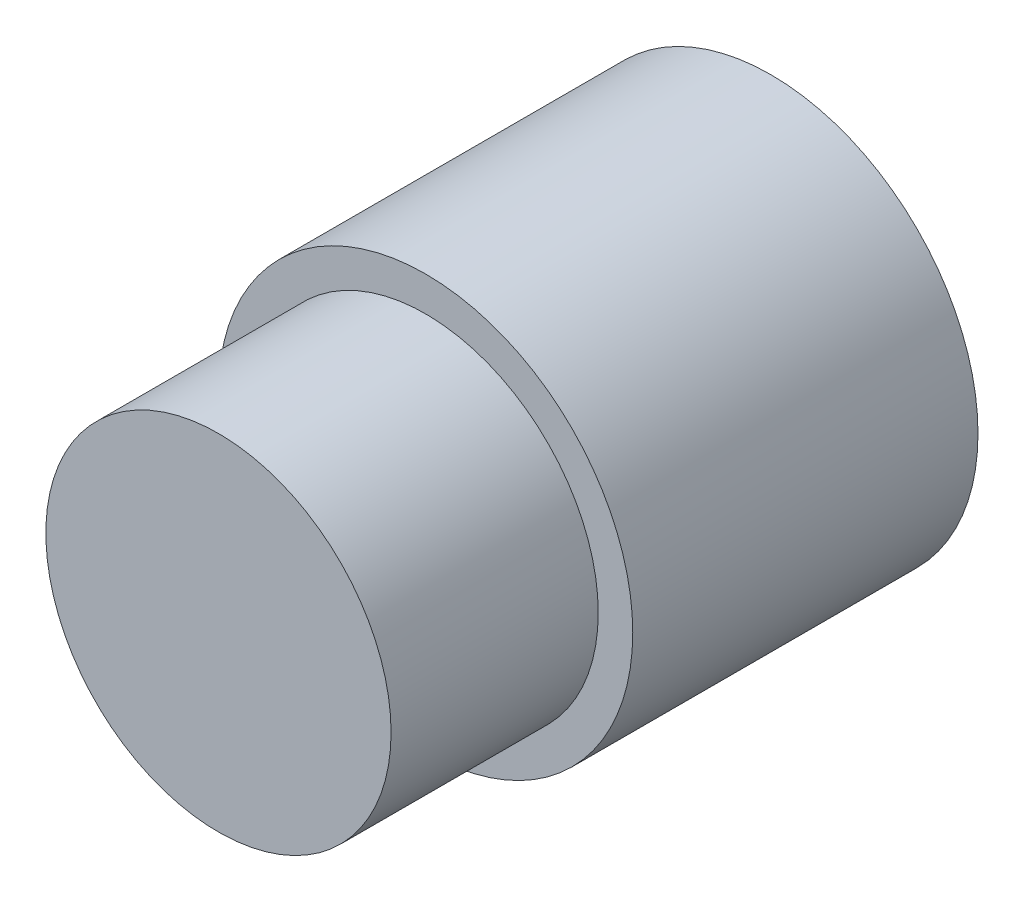
ISO-10303-21;
HEADER;
FILE_DESCRIPTION(('STEP AP214'),'2;1');
FILE_NAME('part.step','',(''),(''),'','','');
FILE_SCHEMA(('AUTOMOTIVE_DESIGN { 1 0 10303 214 1 1 1 1 }'));
ENDSEC;
DATA;
#1=APPLICATION_CONTEXT('core data for automotive mechanical design processes');
#2=APPLICATION_PROTOCOL_DEFINITION('international standard','automotive_design',2000,#1);
#3=PRODUCT_CONTEXT('',#1,'mechanical');
#4=PRODUCT('Part','Part','',(#3));
#5=PRODUCT_RELATED_PRODUCT_CATEGORY('part','',(#4));
#6=PRODUCT_DEFINITION_FORMATION('','',#4);
#7=PRODUCT_DEFINITION_CONTEXT('part definition',#1,'design');
#8=PRODUCT_DEFINITION('design','',#6,#7);
#9=PRODUCT_DEFINITION_SHAPE('','',#8);
#10=(LENGTH_UNIT() NAMED_UNIT(*) SI_UNIT(.MILLI.,.METRE.));
#11=(NAMED_UNIT(*) PLANE_ANGLE_UNIT() SI_UNIT($,.RADIAN.));
#12=(NAMED_UNIT(*) SI_UNIT($,.STERADIAN.) SOLID_ANGLE_UNIT());
#13=UNCERTAINTY_MEASURE_WITH_UNIT(LENGTH_MEASURE(1.E-05),#10,'distance_accuracy_value','');
#14=(GEOMETRIC_REPRESENTATION_CONTEXT(3) GLOBAL_UNCERTAINTY_ASSIGNED_CONTEXT((#13)) GLOBAL_UNIT_ASSIGNED_CONTEXT((#10,
#11,#12)) REPRESENTATION_CONTEXT('',''));
#15=CARTESIAN_POINT('',(0.,0.,0.));
#16=DIRECTION('',(0.,0.,1.));
#17=DIRECTION('',(1.,0.,0.));
#18=AXIS2_PLACEMENT_3D('',#15,#16,#17);
#19=CARTESIAN_POINT('',(0.,0.,5.));
#20=DIRECTION('',(0.,0.,1.));
#21=DIRECTION('',(1.,0.,0.));
#22=AXIS2_PLACEMENT_3D('',#19,#20,#21);
#23=PLANE('',#22);
#24=CARTESIAN_POINT('',(0.,0.,5.));
#25=DIRECTION('',(0.,0.,1.));
#26=DIRECTION('',(1.,0.,0.));
#27=AXIS2_PLACEMENT_3D('',#24,#25,#26);
#28=CIRCLE('',#27,3.);
#29=CARTESIAN_POINT('',(3.,0.,5.));
#30=VERTEX_POINT('',#29);
#31=EDGE_CURVE('E10',#30,#30,#28,.T.);
#32=ORIENTED_EDGE('',*,*,#31,.T.);
#33=EDGE_LOOP('',(#32));
#34=FACE_BOUND('',#33,.T.);
#35=CARTESIAN_POINT('',(0.,0.,5.));
#36=DIRECTION('',(0.,0.,1.));
#37=DIRECTION('',(1.,0.,0.));
#38=AXIS2_PLACEMENT_3D('',#35,#36,#37);
#39=CIRCLE('',#38,2.5);
#40=CARTESIAN_POINT('',(2.5,0.,5.));
#41=VERTEX_POINT('',#40);
#42=EDGE_CURVE('E46',#41,#41,#39,.T.);
#43=ORIENTED_EDGE('',*,*,#42,.F.);
#44=EDGE_LOOP('',(#43));
#45=FACE_BOUND('',#44,.T.);
#46=ADVANCED_FACE('F33',(#34,#45),#23,.T.);
#47=CARTESIAN_POINT('',(0.,0.,5.));
#48=DIRECTION('',(0.,0.,-1.));
#49=DIRECTION('',(-1.,0.,0.));
#50=AXIS2_PLACEMENT_3D('',#47,#48,#49);
#51=CYLINDRICAL_SURFACE('',#50,3.);
#52=ORIENTED_EDGE('',*,*,#31,.F.);
#53=EDGE_LOOP('',(#52));
#54=FACE_BOUND('',#53,.T.);
#55=CARTESIAN_POINT('',(0.,0.,0.));
#56=DIRECTION('',(0.,0.,1.));
#57=DIRECTION('',(1.,0.,0.));
#58=AXIS2_PLACEMENT_3D('',#55,#56,#57);
#59=CIRCLE('',#58,3.);
#60=CARTESIAN_POINT('',(3.,0.,0.));
#61=VERTEX_POINT('',#60);
#62=EDGE_CURVE('E37',#61,#61,#59,.T.);
#63=ORIENTED_EDGE('',*,*,#62,.T.);
#64=EDGE_LOOP('',(#63));
#65=FACE_BOUND('',#64,.T.);
#66=ADVANCED_FACE('F35',(#54,#65),#51,.T.);
#67=CARTESIAN_POINT('',(0.,0.,0.));
#68=DIRECTION('',(0.,0.,1.));
#69=DIRECTION('',(1.,0.,0.));
#70=AXIS2_PLACEMENT_3D('',#67,#68,#69);
#71=PLANE('',#70);
#72=ORIENTED_EDGE('',*,*,#62,.F.);
#73=EDGE_LOOP('',(#72));
#74=FACE_BOUND('',#73,.T.);
#75=ADVANCED_FACE('F57',(#74),#71,.F.);
#76=CARTESIAN_POINT('',(0.,0.,8.));
#77=DIRECTION('',(0.,0.,-1.));
#78=DIRECTION('',(-1.,0.,0.));
#79=AXIS2_PLACEMENT_3D('',#76,#77,#78);
#80=CYLINDRICAL_SURFACE('',#79,2.5);
#81=CARTESIAN_POINT('',(0.,0.,8.));
#82=DIRECTION('',(0.,0.,1.));
#83=DIRECTION('',(1.,0.,0.));
#84=AXIS2_PLACEMENT_3D('',#81,#82,#83);
#85=CIRCLE('',#84,2.5);
#86=CARTESIAN_POINT('',(2.5,0.,8.));
#87=VERTEX_POINT('',#86);
#88=EDGE_CURVE('E44',#87,#87,#85,.T.);
#89=ORIENTED_EDGE('',*,*,#88,.F.);
#90=EDGE_LOOP('',(#89));
#91=FACE_BOUND('',#90,.T.);
#92=ORIENTED_EDGE('',*,*,#42,.T.);
#93=EDGE_LOOP('',(#92));
#94=FACE_BOUND('',#93,.T.);
#95=ADVANCED_FACE('F54',(#91,#94),#80,.T.);
#96=CARTESIAN_POINT('',(0.,0.,8.));
#97=DIRECTION('',(0.,0.,1.));
#98=DIRECTION('',(1.,0.,0.));
#99=AXIS2_PLACEMENT_3D('',#96,#97,#98);
#100=PLANE('',#99);
#101=ORIENTED_EDGE('',*,*,#88,.T.);
#102=EDGE_LOOP('',(#101));
#103=FACE_BOUND('',#102,.T.);
#104=ADVANCED_FACE('F52',(#103),#100,.T.);
#105=CLOSED_SHELL('',(#46,#66,#75,#95,#104));
#106=MANIFOLD_SOLID_BREP('B2',#105);
#107=ADVANCED_BREP_SHAPE_REPRESENTATION('',(#18,#106),#14);
#108=SHAPE_DEFINITION_REPRESENTATION(#9,#107);
ENDSEC;
END-ISO-10303-21;
